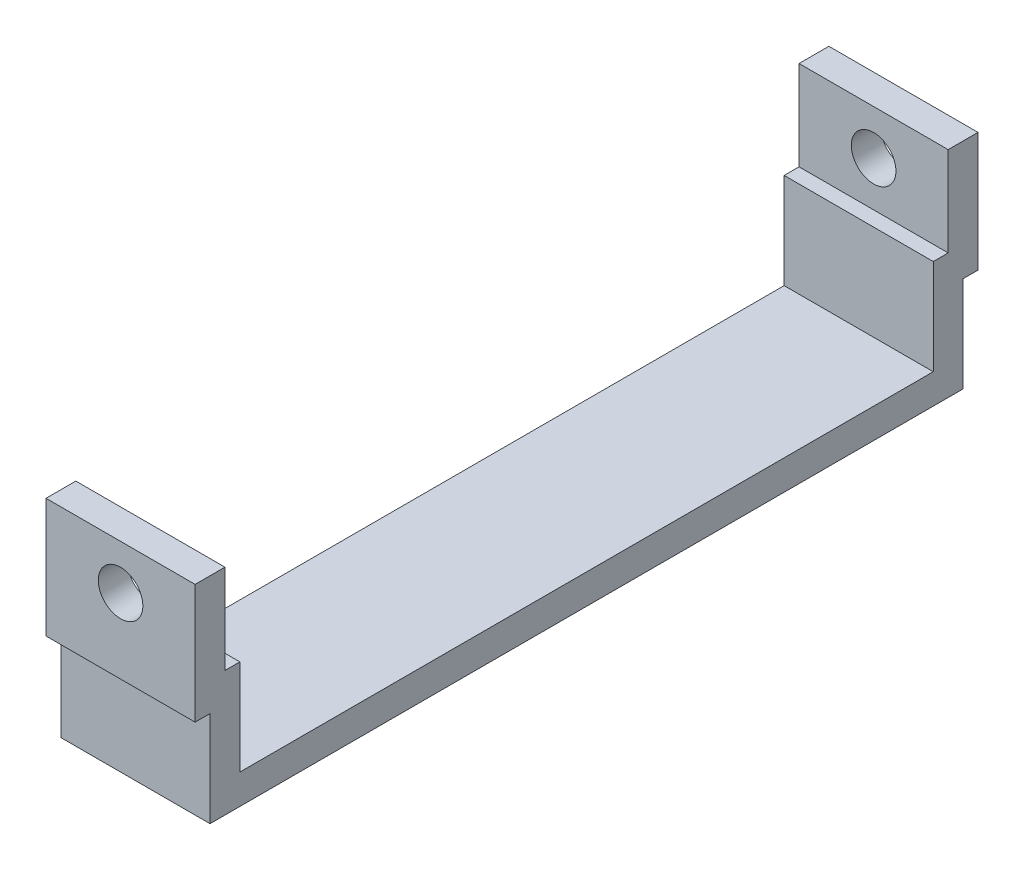
ISO-10303-21;
HEADER;
FILE_DESCRIPTION(('STEP AP214'),'2;1');
FILE_NAME('part.step','',(''),(''),'','','');
FILE_SCHEMA(('AUTOMOTIVE_DESIGN { 1 0 10303 214 1 1 1 1 }'));
ENDSEC;
DATA;
#1=APPLICATION_CONTEXT('core data for automotive mechanical design processes');
#2=APPLICATION_PROTOCOL_DEFINITION('international standard','automotive_design',2000,#1);
#3=PRODUCT_CONTEXT('',#1,'mechanical');
#4=PRODUCT('Part','Part','',(#3));
#5=PRODUCT_RELATED_PRODUCT_CATEGORY('part','',(#4));
#6=PRODUCT_DEFINITION_FORMATION('','',#4);
#7=PRODUCT_DEFINITION_CONTEXT('part definition',#1,'design');
#8=PRODUCT_DEFINITION('design','',#6,#7);
#9=PRODUCT_DEFINITION_SHAPE('','',#8);
#10=(LENGTH_UNIT() NAMED_UNIT(*) SI_UNIT(.MILLI.,.METRE.));
#11=(NAMED_UNIT(*) PLANE_ANGLE_UNIT() SI_UNIT($,.RADIAN.));
#12=(NAMED_UNIT(*) SI_UNIT($,.STERADIAN.) SOLID_ANGLE_UNIT());
#13=UNCERTAINTY_MEASURE_WITH_UNIT(LENGTH_MEASURE(1.E-05),#10,'distance_accuracy_value','');
#14=(GEOMETRIC_REPRESENTATION_CONTEXT(3) GLOBAL_UNCERTAINTY_ASSIGNED_CONTEXT((#13)) GLOBAL_UNIT_ASSIGNED_CONTEXT((#10,
#11,#12)) REPRESENTATION_CONTEXT('',''));
#15=CARTESIAN_POINT('',(0.,0.,0.));
#16=DIRECTION('',(0.,0.,1.));
#17=DIRECTION('',(1.,0.,0.));
#18=AXIS2_PLACEMENT_3D('',#15,#16,#17);
#19=CARTESIAN_POINT('',(12.7,8.128,1.27));
#20=DIRECTION('',(0.,0.,1.));
#21=DIRECTION('',(1.,0.,0.));
#22=AXIS2_PLACEMENT_3D('',#19,#20,#21);
#23=PLANE('',#22);
#24=CARTESIAN_POINT('',(6.35,11.938,1.27));
#25=DIRECTION('',(0.,0.,-1.));
#26=DIRECTION('',(-1.,0.,0.));
#27=AXIS2_PLACEMENT_3D('',#24,#25,#26);
#28=CIRCLE('',#27,1.89864999999999);
#29=CARTESIAN_POINT('',(4.45135000000001,11.938,1.27));
#30=VERTEX_POINT('',#29);
#31=EDGE_CURVE('E316',#30,#30,#28,.T.);
#32=ORIENTED_EDGE('',*,*,#31,.F.);
#33=EDGE_LOOP('',(#32));
#34=FACE_BOUND('',#33,.T.);
#35=DIRECTION('',(0.,1.,0.));
#36=VECTOR('',#35,1.);
#37=CARTESIAN_POINT('',(0.,8.128,1.27));
#38=LINE('',#37,#36);
#39=CARTESIAN_POINT('',(0.,8.128,1.27));
#40=VERTEX_POINT('',#39);
#41=CARTESIAN_POINT('',(0.,15.748,1.27));
#42=VERTEX_POINT('',#41);
#43=EDGE_CURVE('E175',#40,#42,#38,.T.);
#44=ORIENTED_EDGE('',*,*,#43,.T.);
#45=DIRECTION('',(-1.,0.,0.));
#46=VECTOR('',#45,1.);
#47=CARTESIAN_POINT('',(12.7,15.748,1.27));
#48=LINE('',#47,#46);
#49=CARTESIAN_POINT('',(12.7,15.748,1.27));
#50=VERTEX_POINT('',#49);
#51=EDGE_CURVE('E11',#50,#42,#48,.T.);
#52=ORIENTED_EDGE('',*,*,#51,.F.);
#53=DIRECTION('',(0.,1.,0.));
#54=VECTOR('',#53,1.);
#55=CARTESIAN_POINT('',(12.7,8.128,1.27));
#56=LINE('',#55,#54);
#57=CARTESIAN_POINT('',(12.7,8.128,1.27));
#58=VERTEX_POINT('',#57);
#59=EDGE_CURVE('E112',#58,#50,#56,.T.);
#60=ORIENTED_EDGE('',*,*,#59,.F.);
#61=DIRECTION('',(-1.,0.,0.));
#62=VECTOR('',#61,1.);
#63=CARTESIAN_POINT('',(12.7,8.128,1.27));
#64=LINE('',#63,#62);
#65=EDGE_CURVE('E171',#58,#40,#64,.T.);
#66=ORIENTED_EDGE('',*,*,#65,.T.);
#67=EDGE_LOOP('',(#44,#52,#60,#66));
#68=FACE_BOUND('',#67,.T.);
#69=ADVANCED_FACE('F32',(#34,#68),#23,.F.);
#70=CARTESIAN_POINT('',(12.7,15.748,3.81));
#71=DIRECTION('',(0.,1.,0.));
#72=DIRECTION('',(0.,0.,1.));
#73=AXIS2_PLACEMENT_3D('',#70,#71,#72);
#74=PLANE('',#73);
#75=DIRECTION('',(0.,0.,-1.));
#76=VECTOR('',#75,1.);
#77=CARTESIAN_POINT('',(0.,15.748,3.81));
#78=LINE('',#77,#76);
#79=CARTESIAN_POINT('',(0.,15.748,3.81));
#80=VERTEX_POINT('',#79);
#81=EDGE_CURVE('E178',#80,#42,#78,.T.);
#82=ORIENTED_EDGE('',*,*,#81,.F.);
#83=DIRECTION('',(-1.,0.,0.));
#84=VECTOR('',#83,1.);
#85=CARTESIAN_POINT('',(12.7,15.748,3.81));
#86=LINE('',#85,#84);
#87=CARTESIAN_POINT('',(12.7,15.748,3.81));
#88=VERTEX_POINT('',#87);
#89=EDGE_CURVE('E40',#88,#80,#86,.T.);
#90=ORIENTED_EDGE('',*,*,#89,.F.);
#91=DIRECTION('',(0.,0.,-1.));
#92=VECTOR('',#91,1.);
#93=CARTESIAN_POINT('',(12.7,15.748,3.81));
#94=LINE('',#93,#92);
#95=EDGE_CURVE('E261',#88,#50,#94,.T.);
#96=ORIENTED_EDGE('',*,*,#95,.T.);
#97=ORIENTED_EDGE('',*,*,#51,.T.);
#98=EDGE_LOOP('',(#82,#90,#96,#97));
#99=FACE_BOUND('',#98,.T.);
#100=ADVANCED_FACE('F248',(#99),#74,.T.);
#101=CARTESIAN_POINT('',(12.7,8.128,3.81));
#102=DIRECTION('',(0.,0.,1.));
#103=DIRECTION('',(1.,0.,0.));
#104=AXIS2_PLACEMENT_3D('',#101,#102,#103);
#105=PLANE('',#104);
#106=CARTESIAN_POINT('',(6.35,11.938,3.81));
#107=DIRECTION('',(0.,0.,1.));
#108=DIRECTION('',(1.,0.,0.));
#109=AXIS2_PLACEMENT_3D('',#106,#107,#108);
#110=CIRCLE('',#109,1.89864999999999);
#111=CARTESIAN_POINT('',(8.24864999999999,11.938,3.81));
#112=VERTEX_POINT('',#111);
#113=EDGE_CURVE('E179',#112,#112,#110,.T.);
#114=ORIENTED_EDGE('',*,*,#113,.F.);
#115=EDGE_LOOP('',(#114));
#116=FACE_BOUND('',#115,.T.);
#117=DIRECTION('',(0.,1.,0.));
#118=VECTOR('',#117,1.);
#119=CARTESIAN_POINT('',(0.,8.128,3.81));
#120=LINE('',#119,#118);
#121=CARTESIAN_POINT('',(0.,5.588,3.81));
#122=VERTEX_POINT('',#121);
#123=EDGE_CURVE('E182',#122,#80,#120,.T.);
#124=ORIENTED_EDGE('',*,*,#123,.F.);
#125=DIRECTION('',(-1.,0.,0.));
#126=VECTOR('',#125,1.);
#127=CARTESIAN_POINT('',(12.7,5.588,3.81));
#128=LINE('',#127,#126);
#129=CARTESIAN_POINT('',(12.7,5.588,3.81));
#130=VERTEX_POINT('',#129);
#131=EDGE_CURVE('E238',#130,#122,#128,.T.);
#132=ORIENTED_EDGE('',*,*,#131,.F.);
#133=DIRECTION('',(0.,1.,0.));
#134=VECTOR('',#133,1.);
#135=CARTESIAN_POINT('',(12.7,8.128,3.81));
#136=LINE('',#135,#134);
#137=EDGE_CURVE('E245',#130,#88,#136,.T.);
#138=ORIENTED_EDGE('',*,*,#137,.T.);
#139=ORIENTED_EDGE('',*,*,#89,.T.);
#140=EDGE_LOOP('',(#124,#132,#138,#139));
#141=FACE_BOUND('',#140,.T.);
#142=ADVANCED_FACE('F243',(#116,#141),#105,.T.);
#143=CARTESIAN_POINT('',(12.7,5.588,0.));
#144=DIRECTION('',(0.,-1.,0.));
#145=DIRECTION('',(0.,0.,-1.));
#146=AXIS2_PLACEMENT_3D('',#143,#144,#145);
#147=PLANE('',#146);
#148=DIRECTION('',(0.,0.,-1.));
#149=VECTOR('',#148,1.);
#150=CARTESIAN_POINT('',(0.,5.588,0.));
#151=LINE('',#150,#149);
#152=CARTESIAN_POINT('',(0.,5.588,2.54));
#153=VERTEX_POINT('',#152);
#154=EDGE_CURVE('E185',#153,#122,#151,.F.);
#155=ORIENTED_EDGE('',*,*,#154,.F.);
#156=DIRECTION('',(-1.,0.,0.));
#157=VECTOR('',#156,1.);
#158=CARTESIAN_POINT('',(12.7,5.588,2.54));
#159=LINE('',#158,#157);
#160=CARTESIAN_POINT('',(12.7,5.588,2.54));
#161=VERTEX_POINT('',#160);
#162=EDGE_CURVE('E236',#161,#153,#159,.T.);
#163=ORIENTED_EDGE('',*,*,#162,.F.);
#164=DIRECTION('',(0.,0.,-1.));
#165=VECTOR('',#164,1.);
#166=CARTESIAN_POINT('',(12.7,5.588,0.));
#167=LINE('',#166,#165);
#168=EDGE_CURVE('E258',#161,#130,#167,.F.);
#169=ORIENTED_EDGE('',*,*,#168,.T.);
#170=ORIENTED_EDGE('',*,*,#131,.T.);
#171=EDGE_LOOP('',(#155,#163,#169,#170));
#172=FACE_BOUND('',#171,.T.);
#173=ADVANCED_FACE('F255',(#172),#147,.T.);
#174=CARTESIAN_POINT('',(12.7,0.,2.54));
#175=DIRECTION('',(0.,0.,1.));
#176=DIRECTION('',(1.,0.,0.));
#177=AXIS2_PLACEMENT_3D('',#174,#175,#176);
#178=PLANE('',#177);
#179=DIRECTION('',(0.,1.,0.));
#180=VECTOR('',#179,1.);
#181=CARTESIAN_POINT('',(0.,0.,2.54));
#182=LINE('',#181,#180);
#183=CARTESIAN_POINT('',(0.,-2.54,2.54));
#184=VERTEX_POINT('',#183);
#185=EDGE_CURVE('E188',#184,#153,#182,.T.);
#186=ORIENTED_EDGE('',*,*,#185,.F.);
#187=DIRECTION('',(-1.,0.,0.));
#188=VECTOR('',#187,1.);
#189=CARTESIAN_POINT('',(12.7,-2.54,2.54));
#190=LINE('',#189,#188);
#191=CARTESIAN_POINT('',(12.7,-2.54,2.54));
#192=VERTEX_POINT('',#191);
#193=EDGE_CURVE('E234',#192,#184,#190,.T.);
#194=ORIENTED_EDGE('',*,*,#193,.F.);
#195=DIRECTION('',(0.,1.,0.));
#196=VECTOR('',#195,1.);
#197=CARTESIAN_POINT('',(12.7,0.,2.54));
#198=LINE('',#197,#196);
#199=EDGE_CURVE('E263',#192,#161,#198,.T.);
#200=ORIENTED_EDGE('',*,*,#199,.T.);
#201=ORIENTED_EDGE('',*,*,#162,.T.);
#202=EDGE_LOOP('',(#186,#194,#200,#201));
#203=FACE_BOUND('',#202,.T.);
#204=ADVANCED_FACE('F356',(#203),#178,.T.);
#205=CARTESIAN_POINT('',(12.7,-2.54,0.));
#206=DIRECTION('',(0.,-1.,0.));
#207=DIRECTION('',(0.,0.,-1.));
#208=AXIS2_PLACEMENT_3D('',#205,#206,#207);
#209=PLANE('',#208);
#210=DIRECTION('',(0.,0.,-1.));
#211=VECTOR('',#210,1.);
#212=CARTESIAN_POINT('',(0.,-2.54,0.));
#213=LINE('',#212,#211);
#214=CARTESIAN_POINT('',(0.,-2.54,-61.595));
#215=VERTEX_POINT('',#214);
#216=EDGE_CURVE('E191',#215,#184,#213,.F.);
#217=ORIENTED_EDGE('',*,*,#216,.F.);
#218=DIRECTION('',(-1.,0.,0.));
#219=VECTOR('',#218,1.);
#220=CARTESIAN_POINT('',(12.7,-2.54,-61.595));
#221=LINE('',#220,#219);
#222=CARTESIAN_POINT('',(12.7,-2.54,-61.595));
#223=VERTEX_POINT('',#222);
#224=EDGE_CURVE('E232',#223,#215,#221,.T.);
#225=ORIENTED_EDGE('',*,*,#224,.F.);
#226=DIRECTION('',(0.,0.,-1.));
#227=VECTOR('',#226,1.);
#228=CARTESIAN_POINT('',(12.7,-2.54,0.));
#229=LINE('',#228,#227);
#230=EDGE_CURVE('E269',#223,#192,#229,.F.);
#231=ORIENTED_EDGE('',*,*,#230,.T.);
#232=ORIENTED_EDGE('',*,*,#193,.T.);
#233=EDGE_LOOP('',(#217,#225,#231,#232));
#234=FACE_BOUND('',#233,.T.);
#235=ADVANCED_FACE('F354',(#234),#209,.T.);
#236=CARTESIAN_POINT('',(12.7,0.,-61.595));
#237=DIRECTION('',(0.,0.,-1.));
#238=DIRECTION('',(-1.,0.,0.));
#239=AXIS2_PLACEMENT_3D('',#236,#237,#238);
#240=PLANE('',#239);
#241=DIRECTION('',(0.,1.,0.));
#242=VECTOR('',#241,1.);
#243=CARTESIAN_POINT('',(0.,0.,-61.595));
#244=LINE('',#243,#242);
#245=CARTESIAN_POINT('',(0.,5.588,-61.595));
#246=VERTEX_POINT('',#245);
#247=EDGE_CURVE('E194',#246,#215,#244,.F.);
#248=ORIENTED_EDGE('',*,*,#247,.F.);
#249=DIRECTION('',(-1.,0.,0.));
#250=VECTOR('',#249,1.);
#251=CARTESIAN_POINT('',(12.7,5.588,-61.595));
#252=LINE('',#251,#250);
#253=CARTESIAN_POINT('',(12.7,5.588,-61.595));
#254=VERTEX_POINT('',#253);
#255=EDGE_CURVE('E230',#254,#246,#252,.T.);
#256=ORIENTED_EDGE('',*,*,#255,.F.);
#257=DIRECTION('',(0.,1.,0.));
#258=VECTOR('',#257,1.);
#259=CARTESIAN_POINT('',(12.7,0.,-61.595));
#260=LINE('',#259,#258);
#261=EDGE_CURVE('E272',#254,#223,#260,.F.);
#262=ORIENTED_EDGE('',*,*,#261,.T.);
#263=ORIENTED_EDGE('',*,*,#224,.T.);
#264=EDGE_LOOP('',(#248,#256,#262,#263));
#265=FACE_BOUND('',#264,.T.);
#266=ADVANCED_FACE('F350',(#265),#240,.T.);
#267=CARTESIAN_POINT('',(12.7,5.588,-59.055));
#268=DIRECTION('',(0.,-1.,0.));
#269=DIRECTION('',(0.,0.,-1.));
#270=AXIS2_PLACEMENT_3D('',#267,#268,#269);
#271=PLANE('',#270);
#272=DIRECTION('',(0.,0.,-1.));
#273=VECTOR('',#272,1.);
#274=CARTESIAN_POINT('',(0.,5.588,-59.055));
#275=LINE('',#274,#273);
#276=CARTESIAN_POINT('',(0.,5.588,-62.865));
#277=VERTEX_POINT('',#276);
#278=EDGE_CURVE('E197',#277,#246,#275,.F.);
#279=ORIENTED_EDGE('',*,*,#278,.F.);
#280=DIRECTION('',(-1.,0.,0.));
#281=VECTOR('',#280,1.);
#282=CARTESIAN_POINT('',(12.7,5.588,-62.865));
#283=LINE('',#282,#281);
#284=CARTESIAN_POINT('',(12.7,5.588,-62.865));
#285=VERTEX_POINT('',#284);
#286=EDGE_CURVE('E228',#285,#277,#283,.T.);
#287=ORIENTED_EDGE('',*,*,#286,.F.);
#288=DIRECTION('',(0.,0.,-1.));
#289=VECTOR('',#288,1.);
#290=CARTESIAN_POINT('',(12.7,5.588,-59.055));
#291=LINE('',#290,#289);
#292=EDGE_CURVE('E275',#285,#254,#291,.F.);
#293=ORIENTED_EDGE('',*,*,#292,.T.);
#294=ORIENTED_EDGE('',*,*,#255,.T.);
#295=EDGE_LOOP('',(#279,#287,#293,#294));
#296=FACE_BOUND('',#295,.T.);
#297=ADVANCED_FACE('F346',(#296),#271,.T.);
#298=CARTESIAN_POINT('',(12.7,8.128,-62.865));
#299=DIRECTION('',(0.,0.,-1.));
#300=DIRECTION('',(-1.,0.,0.));
#301=AXIS2_PLACEMENT_3D('',#298,#299,#300);
#302=PLANE('',#301);
#303=CARTESIAN_POINT('',(6.35,11.938,-62.865));
#304=DIRECTION('',(0.,0.,-1.));
#305=DIRECTION('',(-1.,0.,0.));
#306=AXIS2_PLACEMENT_3D('',#303,#304,#305);
#307=CIRCLE('',#306,1.89864999999999);
#308=CARTESIAN_POINT('',(4.45135000000001,11.938,-62.865));
#309=VERTEX_POINT('',#308);
#310=EDGE_CURVE('E318',#309,#309,#307,.T.);
#311=ORIENTED_EDGE('',*,*,#310,.F.);
#312=EDGE_LOOP('',(#311));
#313=FACE_BOUND('',#312,.T.);
#314=DIRECTION('',(0.,1.,0.));
#315=VECTOR('',#314,1.);
#316=CARTESIAN_POINT('',(0.,8.128,-62.865));
#317=LINE('',#316,#315);
#318=CARTESIAN_POINT('',(0.,15.748,-62.865));
#319=VERTEX_POINT('',#318);
#320=EDGE_CURVE('E200',#319,#277,#317,.F.);
#321=ORIENTED_EDGE('',*,*,#320,.F.);
#322=DIRECTION('',(-1.,0.,0.));
#323=VECTOR('',#322,1.);
#324=CARTESIAN_POINT('',(12.7,15.748,-62.865));
#325=LINE('',#324,#323);
#326=CARTESIAN_POINT('',(12.7,15.748,-62.865));
#327=VERTEX_POINT('',#326);
#328=EDGE_CURVE('E226',#327,#319,#325,.T.);
#329=ORIENTED_EDGE('',*,*,#328,.F.);
#330=DIRECTION('',(0.,1.,0.));
#331=VECTOR('',#330,1.);
#332=CARTESIAN_POINT('',(12.7,8.128,-62.865));
#333=LINE('',#332,#331);
#334=EDGE_CURVE('E278',#327,#285,#333,.F.);
#335=ORIENTED_EDGE('',*,*,#334,.T.);
#336=ORIENTED_EDGE('',*,*,#286,.T.);
#337=EDGE_LOOP('',(#321,#329,#335,#336));
#338=FACE_BOUND('',#337,.T.);
#339=ADVANCED_FACE('F342',(#313,#338),#302,.T.);
#340=CARTESIAN_POINT('',(12.7,15.748,-60.325));
#341=DIRECTION('',(0.,1.,0.));
#342=DIRECTION('',(0.,0.,1.));
#343=AXIS2_PLACEMENT_3D('',#340,#341,#342);
#344=PLANE('',#343);
#345=DIRECTION('',(0.,0.,-1.));
#346=VECTOR('',#345,1.);
#347=CARTESIAN_POINT('',(0.,15.748,-60.325));
#348=LINE('',#347,#346);
#349=CARTESIAN_POINT('',(0.,15.748,-60.325));
#350=VERTEX_POINT('',#349);
#351=EDGE_CURVE('E203',#350,#319,#348,.T.);
#352=ORIENTED_EDGE('',*,*,#351,.F.);
#353=DIRECTION('',(-1.,0.,0.));
#354=VECTOR('',#353,1.);
#355=CARTESIAN_POINT('',(12.7,15.748,-60.325));
#356=LINE('',#355,#354);
#357=CARTESIAN_POINT('',(12.7,15.748,-60.325));
#358=VERTEX_POINT('',#357);
#359=EDGE_CURVE('E224',#358,#350,#356,.T.);
#360=ORIENTED_EDGE('',*,*,#359,.F.);
#361=DIRECTION('',(0.,0.,-1.));
#362=VECTOR('',#361,1.);
#363=CARTESIAN_POINT('',(12.7,15.748,-60.325));
#364=LINE('',#363,#362);
#365=EDGE_CURVE('E281',#358,#327,#364,.T.);
#366=ORIENTED_EDGE('',*,*,#365,.T.);
#367=ORIENTED_EDGE('',*,*,#328,.T.);
#368=EDGE_LOOP('',(#352,#360,#366,#367));
#369=FACE_BOUND('',#368,.T.);
#370=ADVANCED_FACE('F334',(#369),#344,.T.);
#371=CARTESIAN_POINT('',(12.7,8.128,-60.325));
#372=DIRECTION('',(0.,0.,-1.));
#373=DIRECTION('',(-1.,0.,0.));
#374=AXIS2_PLACEMENT_3D('',#371,#372,#373);
#375=PLANE('',#374);
#376=CARTESIAN_POINT('',(6.35,11.938,-60.325));
#377=DIRECTION('',(0.,0.,1.));
#378=DIRECTION('',(1.,0.,0.));
#379=AXIS2_PLACEMENT_3D('',#376,#377,#378);
#380=CIRCLE('',#379,1.89864999999999);
#381=CARTESIAN_POINT('',(8.24864999999999,11.938,-60.325));
#382=VERTEX_POINT('',#381);
#383=EDGE_CURVE('E323',#382,#382,#380,.T.);
#384=ORIENTED_EDGE('',*,*,#383,.F.);
#385=EDGE_LOOP('',(#384));
#386=FACE_BOUND('',#385,.T.);
#387=DIRECTION('',(0.,-1.,0.));
#388=VECTOR('',#387,1.);
#389=CARTESIAN_POINT('',(0.,8.128,-60.325));
#390=LINE('',#389,#388);
#391=CARTESIAN_POINT('',(0.,8.128,-60.325));
#392=VERTEX_POINT('',#391);
#393=EDGE_CURVE('E206',#350,#392,#390,.T.);
#394=ORIENTED_EDGE('',*,*,#393,.T.);
#395=DIRECTION('',(-1.,0.,0.));
#396=VECTOR('',#395,1.);
#397=CARTESIAN_POINT('',(12.7,8.128,-60.325));
#398=LINE('',#397,#396);
#399=CARTESIAN_POINT('',(12.7,8.128,-60.325));
#400=VERTEX_POINT('',#399);
#401=EDGE_CURVE('E221',#400,#392,#398,.T.);
#402=ORIENTED_EDGE('',*,*,#401,.F.);
#403=DIRECTION('',(0.,-1.,0.));
#404=VECTOR('',#403,1.);
#405=CARTESIAN_POINT('',(12.7,8.128,-60.325));
#406=LINE('',#405,#404);
#407=EDGE_CURVE('E284',#358,#400,#406,.T.);
#408=ORIENTED_EDGE('',*,*,#407,.F.);
#409=ORIENTED_EDGE('',*,*,#359,.T.);
#410=EDGE_LOOP('',(#394,#402,#408,#409));
#411=FACE_BOUND('',#410,.T.);
#412=ADVANCED_FACE('F331',(#386,#411),#375,.F.);
#413=CARTESIAN_POINT('',(12.7,8.128,-59.055));
#414=DIRECTION('',(0.,-1.,0.));
#415=DIRECTION('',(0.,0.,-1.));
#416=AXIS2_PLACEMENT_3D('',#413,#414,#415);
#417=PLANE('',#416);
#418=DIRECTION('',(0.,0.,1.));
#419=VECTOR('',#418,1.);
#420=CARTESIAN_POINT('',(0.,8.128,-59.055));
#421=LINE('',#420,#419);
#422=CARTESIAN_POINT('',(0.,8.128,-59.055));
#423=VERTEX_POINT('',#422);
#424=EDGE_CURVE('E208',#392,#423,#421,.T.);
#425=ORIENTED_EDGE('',*,*,#424,.T.);
#426=DIRECTION('',(-1.,0.,0.));
#427=VECTOR('',#426,1.);
#428=CARTESIAN_POINT('',(12.7,8.128,-59.055));
#429=LINE('',#428,#427);
#430=CARTESIAN_POINT('',(12.7,8.128,-59.055));
#431=VERTEX_POINT('',#430);
#432=EDGE_CURVE('E218',#431,#423,#429,.T.);
#433=ORIENTED_EDGE('',*,*,#432,.F.);
#434=DIRECTION('',(0.,0.,1.));
#435=VECTOR('',#434,1.);
#436=CARTESIAN_POINT('',(12.7,8.128,-59.055));
#437=LINE('',#436,#435);
#438=EDGE_CURVE('E286',#400,#431,#437,.T.);
#439=ORIENTED_EDGE('',*,*,#438,.F.);
#440=ORIENTED_EDGE('',*,*,#401,.T.);
#441=EDGE_LOOP('',(#425,#433,#439,#440));
#442=FACE_BOUND('',#441,.T.);
#443=ADVANCED_FACE('F293',(#442),#417,.F.);
#444=CARTESIAN_POINT('',(12.7,0.,-59.055));
#445=DIRECTION('',(0.,0.,-1.));
#446=DIRECTION('',(-1.,0.,0.));
#447=AXIS2_PLACEMENT_3D('',#444,#445,#446);
#448=PLANE('',#447);
#449=DIRECTION('',(0.,-1.,0.));
#450=VECTOR('',#449,1.);
#451=CARTESIAN_POINT('',(0.,0.,-59.055));
#452=LINE('',#451,#450);
#453=CARTESIAN_POINT('',(0.,0.,-59.055));
#454=VERTEX_POINT('',#453);
#455=EDGE_CURVE('E210',#423,#454,#452,.T.);
#456=ORIENTED_EDGE('',*,*,#455,.T.);
#457=DIRECTION('',(-1.,0.,0.));
#458=VECTOR('',#457,1.);
#459=CARTESIAN_POINT('',(12.7,0.,-59.055));
#460=LINE('',#459,#458);
#461=CARTESIAN_POINT('',(12.7,0.,-59.055));
#462=VERTEX_POINT('',#461);
#463=EDGE_CURVE('E166',#462,#454,#460,.T.);
#464=ORIENTED_EDGE('',*,*,#463,.F.);
#465=DIRECTION('',(0.,-1.,0.));
#466=VECTOR('',#465,1.);
#467=CARTESIAN_POINT('',(12.7,0.,-59.055));
#468=LINE('',#467,#466);
#469=EDGE_CURVE('E157',#431,#462,#468,.T.);
#470=ORIENTED_EDGE('',*,*,#469,.F.);
#471=ORIENTED_EDGE('',*,*,#432,.T.);
#472=EDGE_LOOP('',(#456,#464,#470,#471));
#473=FACE_BOUND('',#472,.T.);
#474=ADVANCED_FACE('F297',(#473),#448,.F.);
#475=CARTESIAN_POINT('',(12.7,0.,0.));
#476=DIRECTION('',(0.,-1.,0.));
#477=DIRECTION('',(0.,0.,-1.));
#478=AXIS2_PLACEMENT_3D('',#475,#476,#477);
#479=PLANE('',#478);
#480=DIRECTION('',(0.,0.,1.));
#481=VECTOR('',#480,1.);
#482=CARTESIAN_POINT('',(0.,0.,0.));
#483=LINE('',#482,#481);
#484=CARTESIAN_POINT('',(0.,0.,0.));
#485=VERTEX_POINT('',#484);
#486=EDGE_CURVE('E165',#454,#485,#483,.T.);
#487=ORIENTED_EDGE('',*,*,#486,.T.);
#488=DIRECTION('',(-1.,0.,0.));
#489=VECTOR('',#488,1.);
#490=CARTESIAN_POINT('',(12.7,0.,0.));
#491=LINE('',#490,#489);
#492=CARTESIAN_POINT('',(12.7,0.,0.));
#493=VERTEX_POINT('',#492);
#494=EDGE_CURVE('E162',#493,#485,#491,.T.);
#495=ORIENTED_EDGE('',*,*,#494,.F.);
#496=DIRECTION('',(0.,0.,1.));
#497=VECTOR('',#496,1.);
#498=CARTESIAN_POINT('',(12.7,0.,0.));
#499=LINE('',#498,#497);
#500=EDGE_CURVE('E151',#462,#493,#499,.T.);
#501=ORIENTED_EDGE('',*,*,#500,.F.);
#502=ORIENTED_EDGE('',*,*,#463,.T.);
#503=EDGE_LOOP('',(#487,#495,#501,#502));
#504=FACE_BOUND('',#503,.T.);
#505=ADVANCED_FACE('F163',(#504),#479,.F.);
#506=CARTESIAN_POINT('',(12.7,0.,0.));
#507=DIRECTION('',(0.,0.,1.));
#508=DIRECTION('',(1.,0.,0.));
#509=AXIS2_PLACEMENT_3D('',#506,#507,#508);
#510=PLANE('',#509);
#511=DIRECTION('',(0.,1.,0.));
#512=VECTOR('',#511,1.);
#513=CARTESIAN_POINT('',(0.,0.,0.));
#514=LINE('',#513,#512);
#515=CARTESIAN_POINT('',(0.,8.128,0.));
#516=VERTEX_POINT('',#515);
#517=EDGE_CURVE('E100',#485,#516,#514,.T.);
#518=ORIENTED_EDGE('',*,*,#517,.T.);
#519=DIRECTION('',(-1.,0.,0.));
#520=VECTOR('',#519,1.);
#521=CARTESIAN_POINT('',(12.7,8.128,0.));
#522=LINE('',#521,#520);
#523=CARTESIAN_POINT('',(12.7,8.128,0.));
#524=VERTEX_POINT('',#523);
#525=EDGE_CURVE('E167',#524,#516,#522,.T.);
#526=ORIENTED_EDGE('',*,*,#525,.F.);
#527=DIRECTION('',(0.,1.,0.));
#528=VECTOR('',#527,1.);
#529=CARTESIAN_POINT('',(12.7,0.,0.));
#530=LINE('',#529,#528);
#531=EDGE_CURVE('E155',#493,#524,#530,.T.);
#532=ORIENTED_EDGE('',*,*,#531,.F.);
#533=ORIENTED_EDGE('',*,*,#494,.T.);
#534=EDGE_LOOP('',(#518,#526,#532,#533));
#535=FACE_BOUND('',#534,.T.);
#536=ADVANCED_FACE('F169',(#535),#510,.F.);
#537=CARTESIAN_POINT('',(12.7,8.128,0.));
#538=DIRECTION('',(0.,-1.,0.));
#539=DIRECTION('',(0.,0.,-1.));
#540=AXIS2_PLACEMENT_3D('',#537,#538,#539);
#541=PLANE('',#540);
#542=DIRECTION('',(0.,0.,1.));
#543=VECTOR('',#542,1.);
#544=CARTESIAN_POINT('',(0.,8.128,0.));
#545=LINE('',#544,#543);
#546=EDGE_CURVE('E106',#516,#40,#545,.T.);
#547=ORIENTED_EDGE('',*,*,#546,.T.);
#548=ORIENTED_EDGE('',*,*,#65,.F.);
#549=DIRECTION('',(0.,0.,1.));
#550=VECTOR('',#549,1.);
#551=CARTESIAN_POINT('',(12.7,8.128,0.));
#552=LINE('',#551,#550);
#553=EDGE_CURVE('E48',#524,#58,#552,.T.);
#554=ORIENTED_EDGE('',*,*,#553,.F.);
#555=ORIENTED_EDGE('',*,*,#525,.T.);
#556=EDGE_LOOP('',(#547,#548,#554,#555));
#557=FACE_BOUND('',#556,.T.);
#558=ADVANCED_FACE('F299',(#557),#541,.F.);
#559=CARTESIAN_POINT('',(12.7,0.,0.));
#560=DIRECTION('',(-1.,0.,0.));
#561=DIRECTION('',(0.,0.,1.));
#562=AXIS2_PLACEMENT_3D('',#559,#560,#561);
#563=PLANE('',#562);
#564=ORIENTED_EDGE('',*,*,#59,.T.);
#565=ORIENTED_EDGE('',*,*,#95,.F.);
#566=ORIENTED_EDGE('',*,*,#137,.F.);
#567=ORIENTED_EDGE('',*,*,#168,.F.);
#568=ORIENTED_EDGE('',*,*,#199,.F.);
#569=ORIENTED_EDGE('',*,*,#230,.F.);
#570=ORIENTED_EDGE('',*,*,#261,.F.);
#571=ORIENTED_EDGE('',*,*,#292,.F.);
#572=ORIENTED_EDGE('',*,*,#334,.F.);
#573=ORIENTED_EDGE('',*,*,#365,.F.);
#574=ORIENTED_EDGE('',*,*,#407,.T.);
#575=ORIENTED_EDGE('',*,*,#438,.T.);
#576=ORIENTED_EDGE('',*,*,#469,.T.);
#577=ORIENTED_EDGE('',*,*,#500,.T.);
#578=ORIENTED_EDGE('',*,*,#531,.T.);
#579=ORIENTED_EDGE('',*,*,#553,.T.);
#580=EDGE_LOOP('',(#564,#565,#566,#567,#568,#569,#570,#571,#572,#573,#574,#575,#576,#577,#578,#579));
#581=FACE_BOUND('',#580,.T.);
#582=ADVANCED_FACE('F153',(#581),#563,.F.);
#583=CARTESIAN_POINT('',(0.,0.,0.));
#584=DIRECTION('',(-1.,0.,0.));
#585=DIRECTION('',(0.,0.,1.));
#586=AXIS2_PLACEMENT_3D('',#583,#584,#585);
#587=PLANE('',#586);
#588=ORIENTED_EDGE('',*,*,#43,.F.);
#589=ORIENTED_EDGE('',*,*,#546,.F.);
#590=ORIENTED_EDGE('',*,*,#517,.F.);
#591=ORIENTED_EDGE('',*,*,#486,.F.);
#592=ORIENTED_EDGE('',*,*,#455,.F.);
#593=ORIENTED_EDGE('',*,*,#424,.F.);
#594=ORIENTED_EDGE('',*,*,#393,.F.);
#595=ORIENTED_EDGE('',*,*,#351,.T.);
#596=ORIENTED_EDGE('',*,*,#320,.T.);
#597=ORIENTED_EDGE('',*,*,#278,.T.);
#598=ORIENTED_EDGE('',*,*,#247,.T.);
#599=ORIENTED_EDGE('',*,*,#216,.T.);
#600=ORIENTED_EDGE('',*,*,#185,.T.);
#601=ORIENTED_EDGE('',*,*,#154,.T.);
#602=ORIENTED_EDGE('',*,*,#123,.T.);
#603=ORIENTED_EDGE('',*,*,#81,.T.);
#604=EDGE_LOOP('',(#588,#589,#590,#591,#592,#593,#594,#595,#596,#597,#598,#599,#600,#601,#602,#603));
#605=FACE_BOUND('',#604,.T.);
#606=ADVANCED_FACE('F251',(#605),#587,.T.);
#607=CARTESIAN_POINT('',(6.35,11.938,1.27));
#608=DIRECTION('',(0.,0.,-1.));
#609=DIRECTION('',(-1.,0.,0.));
#610=AXIS2_PLACEMENT_3D('',#607,#608,#609);
#611=CYLINDRICAL_SURFACE('',#610,1.89864999999999);
#612=ORIENTED_EDGE('',*,*,#113,.T.);
#613=EDGE_LOOP('',(#612));
#614=FACE_BOUND('',#613,.T.);
#615=ORIENTED_EDGE('',*,*,#31,.T.);
#616=EDGE_LOOP('',(#615));
#617=FACE_BOUND('',#616,.T.);
#618=ADVANCED_FACE('F373',(#614,#617),#611,.F.);
#619=CARTESIAN_POINT('',(6.35,11.938,-60.325));
#620=DIRECTION('',(0.,0.,1.));
#621=DIRECTION('',(1.,0.,0.));
#622=AXIS2_PLACEMENT_3D('',#619,#620,#621);
#623=CYLINDRICAL_SURFACE('',#622,1.89864999999999);
#624=ORIENTED_EDGE('',*,*,#310,.T.);
#625=EDGE_LOOP('',(#624));
#626=FACE_BOUND('',#625,.T.);
#627=ORIENTED_EDGE('',*,*,#383,.T.);
#628=EDGE_LOOP('',(#627));
#629=FACE_BOUND('',#628,.T.);
#630=ADVANCED_FACE('F329',(#626,#629),#623,.F.);
#631=CLOSED_SHELL('',(#69,#100,#142,#173,#204,#235,#266,#297,#339,#370,#412,#443,#474,#505,#536,
#558,#582,#606,#618,#630));
#632=MANIFOLD_SOLID_BREP('B2',#631);
#633=ADVANCED_BREP_SHAPE_REPRESENTATION('',(#18,#632),#14);
#634=SHAPE_DEFINITION_REPRESENTATION(#9,#633);
ENDSEC;
END-ISO-10303-21;
